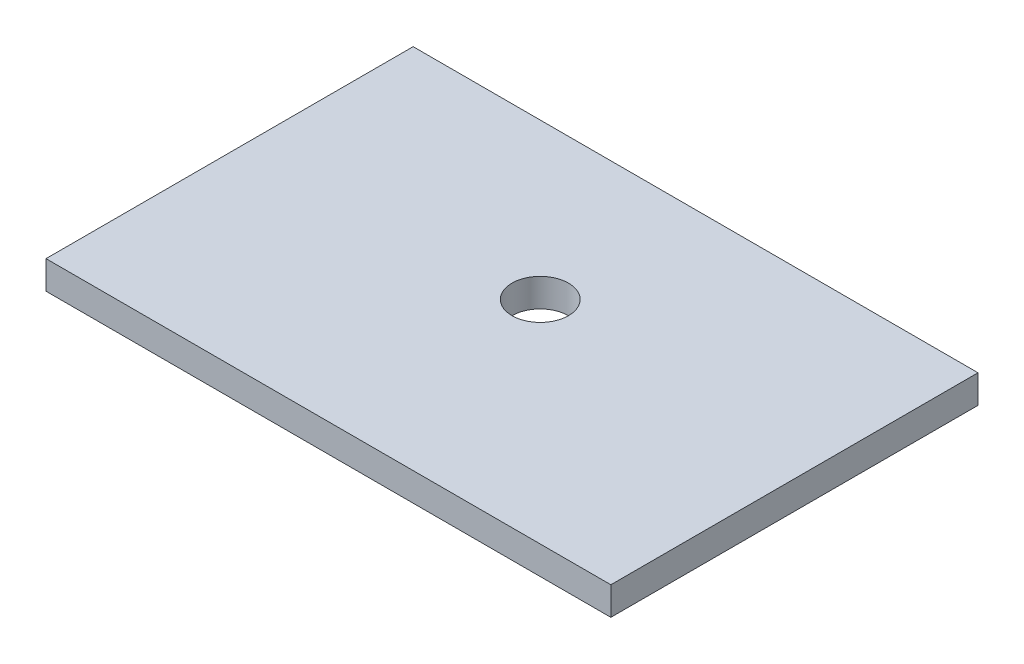
ISO-10303-21;
HEADER;
FILE_DESCRIPTION(('STEP AP214'),'2;1');
FILE_NAME('part.step','',(''),(''),'','','');
FILE_SCHEMA(('AUTOMOTIVE_DESIGN { 1 0 10303 214 1 1 1 1 }'));
ENDSEC;
DATA;
#1=APPLICATION_CONTEXT('core data for automotive mechanical design processes');
#2=APPLICATION_PROTOCOL_DEFINITION('international standard','automotive_design',2000,#1);
#3=PRODUCT_CONTEXT('',#1,'mechanical');
#4=PRODUCT('Part','Part','',(#3));
#5=PRODUCT_RELATED_PRODUCT_CATEGORY('part','',(#4));
#6=PRODUCT_DEFINITION_FORMATION('','',#4);
#7=PRODUCT_DEFINITION_CONTEXT('part definition',#1,'design');
#8=PRODUCT_DEFINITION('design','',#6,#7);
#9=PRODUCT_DEFINITION_SHAPE('','',#8);
#10=(LENGTH_UNIT() NAMED_UNIT(*) SI_UNIT(.MILLI.,.METRE.));
#11=(NAMED_UNIT(*) PLANE_ANGLE_UNIT() SI_UNIT($,.RADIAN.));
#12=(NAMED_UNIT(*) SI_UNIT($,.STERADIAN.) SOLID_ANGLE_UNIT());
#13=UNCERTAINTY_MEASURE_WITH_UNIT(LENGTH_MEASURE(1.E-05),#10,'distance_accuracy_value','');
#14=(GEOMETRIC_REPRESENTATION_CONTEXT(3) GLOBAL_UNCERTAINTY_ASSIGNED_CONTEXT((#13)) GLOBAL_UNIT_ASSIGNED_CONTEXT((#10,
#11,#12)) REPRESENTATION_CONTEXT('',''));
#15=CARTESIAN_POINT('',(0.,0.,0.));
#16=DIRECTION('',(0.,0.,1.));
#17=DIRECTION('',(1.,0.,0.));
#18=AXIS2_PLACEMENT_3D('',#15,#16,#17);
#19=CARTESIAN_POINT('',(0.,10.,0.));
#20=DIRECTION('',(0.,1.,0.));
#21=DIRECTION('',(0.,0.,1.));
#22=AXIS2_PLACEMENT_3D('',#19,#20,#21);
#23=PLANE('',#22);
#24=DIRECTION('',(0.,0.,1.));
#25=VECTOR('',#24,1.);
#26=CARTESIAN_POINT('',(0.,10.,0.));
#27=LINE('',#26,#25);
#28=CARTESIAN_POINT('',(0.,10.,0.));
#29=VERTEX_POINT('',#28);
#30=CARTESIAN_POINT('',(0.,10.,130.));
#31=VERTEX_POINT('',#30);
#32=EDGE_CURVE('E85',#29,#31,#27,.T.);
#33=ORIENTED_EDGE('',*,*,#32,.T.);
#34=DIRECTION('',(1.,0.,0.));
#35=VECTOR('',#34,1.);
#36=CARTESIAN_POINT('',(0.,10.,130.));
#37=LINE('',#36,#35);
#38=CARTESIAN_POINT('',(200.,10.,130.));
#39=VERTEX_POINT('',#38);
#40=EDGE_CURVE('E80',#31,#39,#37,.T.);
#41=ORIENTED_EDGE('',*,*,#40,.T.);
#42=DIRECTION('',(0.,0.,-1.));
#43=VECTOR('',#42,1.);
#44=CARTESIAN_POINT('',(200.,10.,0.));
#45=LINE('',#44,#43);
#46=CARTESIAN_POINT('',(200.,10.,0.));
#47=VERTEX_POINT('',#46);
#48=EDGE_CURVE('E83',#39,#47,#45,.T.);
#49=ORIENTED_EDGE('',*,*,#48,.T.);
#50=DIRECTION('',(-1.,0.,0.));
#51=VECTOR('',#50,1.);
#52=CARTESIAN_POINT('',(0.,10.,0.));
#53=LINE('',#52,#51);
#54=EDGE_CURVE('E50',#47,#29,#53,.T.);
#55=ORIENTED_EDGE('',*,*,#54,.T.);
#56=EDGE_LOOP('',(#33,#41,#49,#55));
#57=FACE_BOUND('',#56,.T.);
#58=CARTESIAN_POINT('',(100.,10.,55.));
#59=DIRECTION('',(0.,1.,0.));
#60=DIRECTION('',(0.,0.,1.));
#61=AXIS2_PLACEMENT_3D('',#58,#59,#60);
#62=CIRCLE('',#61,9.99999999999999);
#63=CARTESIAN_POINT('',(100.,10.,65.));
#64=VERTEX_POINT('',#63);
#65=EDGE_CURVE('E100',#64,#64,#62,.T.);
#66=ORIENTED_EDGE('',*,*,#65,.F.);
#67=EDGE_LOOP('',(#66));
#68=FACE_BOUND('',#67,.T.);
#69=ADVANCED_FACE('F33',(#57,#68),#23,.T.);
#70=CARTESIAN_POINT('',(0.,0.,0.));
#71=DIRECTION('',(0.,1.,0.));
#72=DIRECTION('',(0.,0.,1.));
#73=AXIS2_PLACEMENT_3D('',#70,#71,#72);
#74=PLANE('',#73);
#75=DIRECTION('',(0.,0.,1.));
#76=VECTOR('',#75,1.);
#77=CARTESIAN_POINT('',(0.,0.,0.));
#78=LINE('',#77,#76);
#79=CARTESIAN_POINT('',(0.,0.,0.));
#80=VERTEX_POINT('',#79);
#81=CARTESIAN_POINT('',(0.,0.,130.));
#82=VERTEX_POINT('',#81);
#83=EDGE_CURVE('E97',#80,#82,#78,.T.);
#84=ORIENTED_EDGE('',*,*,#83,.F.);
#85=DIRECTION('',(-1.,0.,0.));
#86=VECTOR('',#85,1.);
#87=CARTESIAN_POINT('',(0.,0.,0.));
#88=LINE('',#87,#86);
#89=CARTESIAN_POINT('',(200.,0.,0.));
#90=VERTEX_POINT('',#89);
#91=EDGE_CURVE('E73',#90,#80,#88,.T.);
#92=ORIENTED_EDGE('',*,*,#91,.F.);
#93=DIRECTION('',(0.,0.,-1.));
#94=VECTOR('',#93,1.);
#95=CARTESIAN_POINT('',(200.,0.,0.));
#96=LINE('',#95,#94);
#97=CARTESIAN_POINT('',(200.,0.,130.));
#98=VERTEX_POINT('',#97);
#99=EDGE_CURVE('E67',#98,#90,#96,.T.);
#100=ORIENTED_EDGE('',*,*,#99,.F.);
#101=DIRECTION('',(1.,0.,0.));
#102=VECTOR('',#101,1.);
#103=CARTESIAN_POINT('',(0.,0.,130.));
#104=LINE('',#103,#102);
#105=EDGE_CURVE('E89',#82,#98,#104,.T.);
#106=ORIENTED_EDGE('',*,*,#105,.F.);
#107=EDGE_LOOP('',(#84,#92,#100,#106));
#108=FACE_BOUND('',#107,.T.);
#109=CARTESIAN_POINT('',(100.,0.,55.));
#110=DIRECTION('',(0.,1.,0.));
#111=DIRECTION('',(0.,0.,1.));
#112=AXIS2_PLACEMENT_3D('',#109,#110,#111);
#113=CIRCLE('',#112,9.99999999999999);
#114=CARTESIAN_POINT('',(100.,0.,65.));
#115=VERTEX_POINT('',#114);
#116=EDGE_CURVE('E112',#115,#115,#113,.T.);
#117=ORIENTED_EDGE('',*,*,#116,.T.);
#118=EDGE_LOOP('',(#117));
#119=FACE_BOUND('',#118,.T.);
#120=ADVANCED_FACE('F108',(#108,#119),#74,.F.);
#121=CARTESIAN_POINT('',(0.,10.,0.));
#122=DIRECTION('',(1.,0.,0.));
#123=DIRECTION('',(0.,0.,-1.));
#124=AXIS2_PLACEMENT_3D('',#121,#122,#123);
#125=PLANE('',#124);
#126=ORIENTED_EDGE('',*,*,#83,.T.);
#127=DIRECTION('',(0.,-1.,0.));
#128=VECTOR('',#127,1.);
#129=CARTESIAN_POINT('',(0.,10.,130.));
#130=LINE('',#129,#128);
#131=EDGE_CURVE('E11',#31,#82,#130,.T.);
#132=ORIENTED_EDGE('',*,*,#131,.F.);
#133=ORIENTED_EDGE('',*,*,#32,.F.);
#134=DIRECTION('',(0.,-1.,0.));
#135=VECTOR('',#134,1.);
#136=CARTESIAN_POINT('',(0.,10.,0.));
#137=LINE('',#136,#135);
#138=EDGE_CURVE('E93',#29,#80,#137,.T.);
#139=ORIENTED_EDGE('',*,*,#138,.T.);
#140=EDGE_LOOP('',(#126,#132,#133,#139));
#141=FACE_BOUND('',#140,.T.);
#142=ADVANCED_FACE('F35',(#141),#125,.F.);
#143=CARTESIAN_POINT('',(0.,10.,130.));
#144=DIRECTION('',(0.,0.,-1.));
#145=DIRECTION('',(-1.,0.,0.));
#146=AXIS2_PLACEMENT_3D('',#143,#144,#145);
#147=PLANE('',#146);
#148=ORIENTED_EDGE('',*,*,#105,.T.);
#149=DIRECTION('',(0.,-1.,0.));
#150=VECTOR('',#149,1.);
#151=CARTESIAN_POINT('',(200.,10.,130.));
#152=LINE('',#151,#150);
#153=EDGE_CURVE('E42',#39,#98,#152,.T.);
#154=ORIENTED_EDGE('',*,*,#153,.F.);
#155=ORIENTED_EDGE('',*,*,#40,.F.);
#156=ORIENTED_EDGE('',*,*,#131,.T.);
#157=EDGE_LOOP('',(#148,#154,#155,#156));
#158=FACE_BOUND('',#157,.T.);
#159=ADVANCED_FACE('F88',(#158),#147,.F.);
#160=CARTESIAN_POINT('',(200.,10.,0.));
#161=DIRECTION('',(-1.,0.,0.));
#162=DIRECTION('',(0.,0.,1.));
#163=AXIS2_PLACEMENT_3D('',#160,#161,#162);
#164=PLANE('',#163);
#165=ORIENTED_EDGE('',*,*,#99,.T.);
#166=DIRECTION('',(0.,-1.,0.));
#167=VECTOR('',#166,1.);
#168=CARTESIAN_POINT('',(200.,10.,0.));
#169=LINE('',#168,#167);
#170=EDGE_CURVE('E90',#47,#90,#169,.T.);
#171=ORIENTED_EDGE('',*,*,#170,.F.);
#172=ORIENTED_EDGE('',*,*,#48,.F.);
#173=ORIENTED_EDGE('',*,*,#153,.T.);
#174=EDGE_LOOP('',(#165,#171,#172,#173));
#175=FACE_BOUND('',#174,.T.);
#176=ADVANCED_FACE('F91',(#175),#164,.F.);
#177=CARTESIAN_POINT('',(0.,10.,0.));
#178=DIRECTION('',(0.,0.,1.));
#179=DIRECTION('',(1.,0.,0.));
#180=AXIS2_PLACEMENT_3D('',#177,#178,#179);
#181=PLANE('',#180);
#182=ORIENTED_EDGE('',*,*,#91,.T.);
#183=ORIENTED_EDGE('',*,*,#138,.F.);
#184=ORIENTED_EDGE('',*,*,#54,.F.);
#185=ORIENTED_EDGE('',*,*,#170,.T.);
#186=EDGE_LOOP('',(#182,#183,#184,#185));
#187=FACE_BOUND('',#186,.T.);
#188=ADVANCED_FACE('F105',(#187),#181,.F.);
#189=CARTESIAN_POINT('',(100.,10.,55.));
#190=DIRECTION('',(0.,-1.,0.));
#191=DIRECTION('',(0.,0.,-1.));
#192=AXIS2_PLACEMENT_3D('',#189,#190,#191);
#193=CYLINDRICAL_SURFACE('',#192,9.99999999999999);
#194=ORIENTED_EDGE('',*,*,#65,.T.);
#195=EDGE_LOOP('',(#194));
#196=FACE_BOUND('',#195,.T.);
#197=ORIENTED_EDGE('',*,*,#116,.F.);
#198=EDGE_LOOP('',(#197));
#199=FACE_BOUND('',#198,.T.);
#200=ADVANCED_FACE('F118',(#196,#199),#193,.F.);
#201=CLOSED_SHELL('',(#69,#120,#142,#159,#176,#188,#200));
#202=MANIFOLD_SOLID_BREP('B2',#201);
#203=ADVANCED_BREP_SHAPE_REPRESENTATION('',(#18,#202),#14);
#204=SHAPE_DEFINITION_REPRESENTATION(#9,#203);
ENDSEC;
END-ISO-10303-21;
